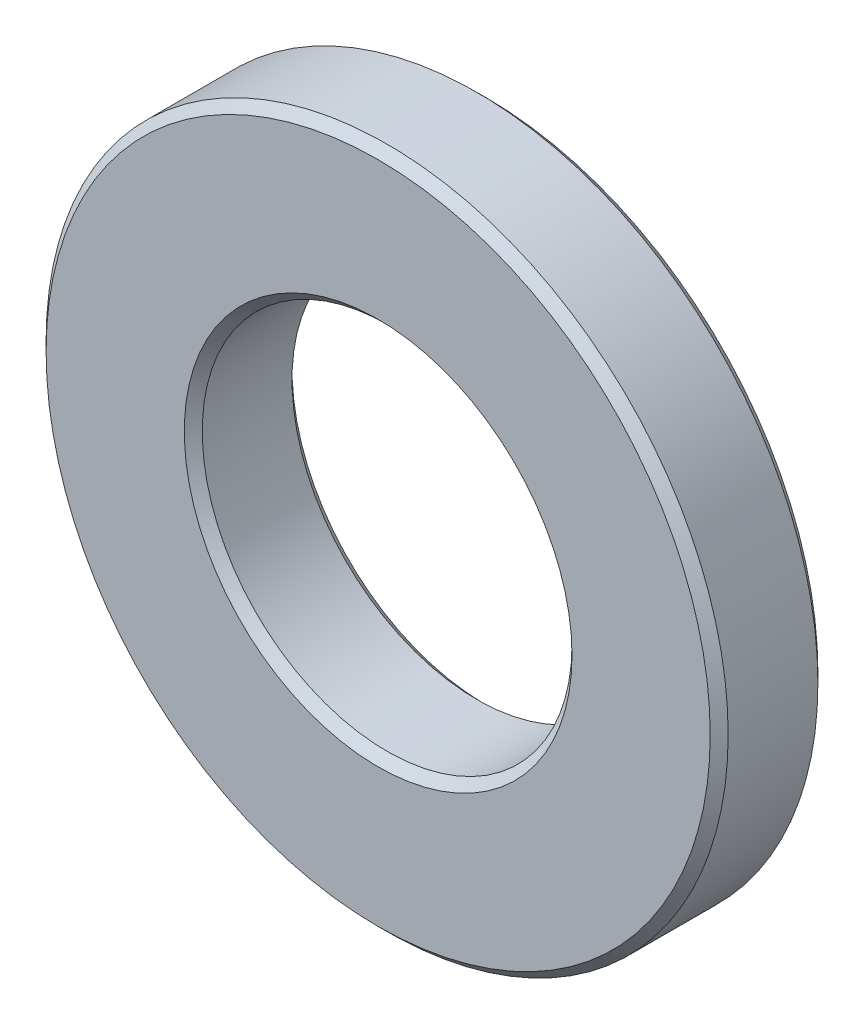
ISO-10303-21;
HEADER;
FILE_DESCRIPTION(('STEP AP214'),'2;1');
FILE_NAME('part.step','',(''),(''),'','','');
FILE_SCHEMA(('AUTOMOTIVE_DESIGN { 1 0 10303 214 1 1 1 1 }'));
ENDSEC;
DATA;
#1=APPLICATION_CONTEXT('core data for automotive mechanical design processes');
#2=APPLICATION_PROTOCOL_DEFINITION('international standard','automotive_design',2000,#1);
#3=PRODUCT_CONTEXT('',#1,'mechanical');
#4=PRODUCT('Part','Part','',(#3));
#5=PRODUCT_RELATED_PRODUCT_CATEGORY('part','',(#4));
#6=PRODUCT_DEFINITION_FORMATION('','',#4);
#7=PRODUCT_DEFINITION_CONTEXT('part definition',#1,'design');
#8=PRODUCT_DEFINITION('design','',#6,#7);
#9=PRODUCT_DEFINITION_SHAPE('','',#8);
#10=(LENGTH_UNIT() NAMED_UNIT(*) SI_UNIT(.MILLI.,.METRE.));
#11=(NAMED_UNIT(*) PLANE_ANGLE_UNIT() SI_UNIT($,.RADIAN.));
#12=(NAMED_UNIT(*) SI_UNIT($,.STERADIAN.) SOLID_ANGLE_UNIT());
#13=UNCERTAINTY_MEASURE_WITH_UNIT(LENGTH_MEASURE(1.E-05),#10,'distance_accuracy_value','');
#14=(GEOMETRIC_REPRESENTATION_CONTEXT(3) GLOBAL_UNCERTAINTY_ASSIGNED_CONTEXT((#13)) GLOBAL_UNIT_ASSIGNED_CONTEXT((#10,
#11,#12)) REPRESENTATION_CONTEXT('',''));
#15=CARTESIAN_POINT('',(0.,0.,0.));
#16=DIRECTION('',(0.,0.,1.));
#17=DIRECTION('',(1.,0.,0.));
#18=AXIS2_PLACEMENT_3D('',#15,#16,#17);
#19=CARTESIAN_POINT('',(0.,0.,6.));
#20=DIRECTION('',(0.,0.,1.));
#21=DIRECTION('',(1.,0.,0.));
#22=AXIS2_PLACEMENT_3D('',#19,#20,#21);
#23=PLANE('',#22);
#24=CARTESIAN_POINT('',(0.,0.,6.));
#25=DIRECTION('',(0.,0.,1.));
#26=DIRECTION('',(1.,0.,0.));
#27=AXIS2_PLACEMENT_3D('',#24,#25,#26);
#28=CIRCLE('',#27,18.5);
#29=CARTESIAN_POINT('',(18.5,0.,6.));
#30=VERTEX_POINT('',#29);
#31=EDGE_CURVE('E50',#30,#30,#28,.T.);
#32=ORIENTED_EDGE('',*,*,#31,.T.);
#33=EDGE_LOOP('',(#32));
#34=FACE_BOUND('',#33,.T.);
#35=CARTESIAN_POINT('',(0.,0.,6.));
#36=DIRECTION('',(0.,0.,1.));
#37=DIRECTION('',(1.,0.,0.));
#38=AXIS2_PLACEMENT_3D('',#35,#36,#37);
#39=CIRCLE('',#38,10.8);
#40=CARTESIAN_POINT('',(10.8,0.,6.));
#41=VERTEX_POINT('',#40);
#42=EDGE_CURVE('E54',#41,#41,#39,.F.);
#43=ORIENTED_EDGE('',*,*,#42,.T.);
#44=EDGE_LOOP('',(#43));
#45=FACE_BOUND('',#44,.T.);
#46=ADVANCED_FACE('F39',(#34,#45),#23,.T.);
#47=CARTESIAN_POINT('',(0.,0.,0.));
#48=DIRECTION('',(0.,0.,1.));
#49=DIRECTION('',(1.,0.,0.));
#50=AXIS2_PLACEMENT_3D('',#47,#48,#49);
#51=PLANE('',#50);
#52=CARTESIAN_POINT('',(0.,0.,0.));
#53=DIRECTION('',(0.,0.,1.));
#54=DIRECTION('',(1.,0.,0.));
#55=AXIS2_PLACEMENT_3D('',#52,#53,#54);
#56=CIRCLE('',#55,18.5);
#57=CARTESIAN_POINT('',(18.5,0.,0.));
#58=VERTEX_POINT('',#57);
#59=EDGE_CURVE('E59',#58,#58,#56,.F.);
#60=ORIENTED_EDGE('',*,*,#59,.T.);
#61=EDGE_LOOP('',(#60));
#62=FACE_BOUND('',#61,.T.);
#63=CARTESIAN_POINT('',(0.,0.,0.));
#64=DIRECTION('',(0.,0.,1.));
#65=DIRECTION('',(1.,0.,0.));
#66=AXIS2_PLACEMENT_3D('',#63,#64,#65);
#67=CIRCLE('',#66,10.8);
#68=CARTESIAN_POINT('',(10.8,0.,0.));
#69=VERTEX_POINT('',#68);
#70=EDGE_CURVE('E62',#69,#69,#67,.T.);
#71=ORIENTED_EDGE('',*,*,#70,.T.);
#72=EDGE_LOOP('',(#71));
#73=FACE_BOUND('',#72,.T.);
#74=ADVANCED_FACE('F84',(#62,#73),#51,.F.);
#75=CARTESIAN_POINT('',(0.,0.,6.));
#76=DIRECTION('',(0.,0.,-1.));
#77=DIRECTION('',(-1.,0.,0.));
#78=AXIS2_PLACEMENT_3D('',#75,#76,#77);
#79=CYLINDRICAL_SURFACE('',#78,19.);
#80=CARTESIAN_POINT('',(0.,0.,0.5));
#81=DIRECTION('',(0.,0.,1.));
#82=DIRECTION('',(1.,0.,0.));
#83=AXIS2_PLACEMENT_3D('',#80,#81,#82);
#84=CIRCLE('',#83,19.);
#85=CARTESIAN_POINT('',(19.,0.,0.5));
#86=VERTEX_POINT('',#85);
#87=EDGE_CURVE('E65',#86,#86,#84,.T.);
#88=ORIENTED_EDGE('',*,*,#87,.T.);
#89=EDGE_LOOP('',(#88));
#90=FACE_BOUND('',#89,.T.);
#91=CARTESIAN_POINT('',(0.,0.,5.49999999999999));
#92=DIRECTION('',(0.,0.,1.));
#93=DIRECTION('',(1.,0.,0.));
#94=AXIS2_PLACEMENT_3D('',#91,#92,#93);
#95=CIRCLE('',#94,19.);
#96=CARTESIAN_POINT('',(19.,0.,5.49999999999999));
#97=VERTEX_POINT('',#96);
#98=EDGE_CURVE('E68',#97,#97,#95,.F.);
#99=ORIENTED_EDGE('',*,*,#98,.T.);
#100=EDGE_LOOP('',(#99));
#101=FACE_BOUND('',#100,.T.);
#102=ADVANCED_FACE('F72',(#90,#101),#79,.T.);
#103=CARTESIAN_POINT('',(0.,0.,6.));
#104=DIRECTION('',(0.,0.,-1.));
#105=DIRECTION('',(-1.,0.,0.));
#106=AXIS2_PLACEMENT_3D('',#103,#104,#105);
#107=CYLINDRICAL_SURFACE('',#106,10.3);
#108=CARTESIAN_POINT('',(0.,0.,0.500000000000002));
#109=DIRECTION('',(0.,0.,1.));
#110=DIRECTION('',(1.,0.,0.));
#111=AXIS2_PLACEMENT_3D('',#108,#109,#110);
#112=CIRCLE('',#111,10.3);
#113=CARTESIAN_POINT('',(10.3,0.,0.500000000000002));
#114=VERTEX_POINT('',#113);
#115=EDGE_CURVE('E10',#114,#114,#112,.F.);
#116=ORIENTED_EDGE('',*,*,#115,.T.);
#117=EDGE_LOOP('',(#116));
#118=FACE_BOUND('',#117,.T.);
#119=CARTESIAN_POINT('',(0.,0.,5.5));
#120=DIRECTION('',(0.,0.,1.));
#121=DIRECTION('',(1.,0.,0.));
#122=AXIS2_PLACEMENT_3D('',#119,#120,#121);
#123=CIRCLE('',#122,10.3);
#124=CARTESIAN_POINT('',(10.3,0.,5.5));
#125=VERTEX_POINT('',#124);
#126=EDGE_CURVE('E46',#125,#125,#123,.T.);
#127=ORIENTED_EDGE('',*,*,#126,.T.);
#128=EDGE_LOOP('',(#127));
#129=FACE_BOUND('',#128,.T.);
#130=ADVANCED_FACE('F100',(#118,#129),#107,.F.);
#131=CARTESIAN_POINT('',(0.,0.,0.5));
#132=DIRECTION('',(0.,0.,1.));
#133=DIRECTION('',(1.,0.,0.));
#134=AXIS2_PLACEMENT_3D('',#131,#132,#133);
#135=CONICAL_SURFACE('',#134,19.,0.785398163397452);
#136=ORIENTED_EDGE('',*,*,#59,.F.);
#137=EDGE_LOOP('',(#136));
#138=FACE_BOUND('',#137,.T.);
#139=ORIENTED_EDGE('',*,*,#87,.F.);
#140=EDGE_LOOP('',(#139));
#141=FACE_BOUND('',#140,.T.);
#142=ADVANCED_FACE('F78',(#138,#141),#135,.T.);
#143=CARTESIAN_POINT('',(0.,0.,6.));
#144=DIRECTION('',(0.,0.,-1.));
#145=DIRECTION('',(-1.,0.,0.));
#146=AXIS2_PLACEMENT_3D('',#143,#144,#145);
#147=CONICAL_SURFACE('',#146,18.5,0.785398163397436);
#148=ORIENTED_EDGE('',*,*,#98,.F.);
#149=EDGE_LOOP('',(#148));
#150=FACE_BOUND('',#149,.T.);
#151=ORIENTED_EDGE('',*,*,#31,.F.);
#152=EDGE_LOOP('',(#151));
#153=FACE_BOUND('',#152,.T.);
#154=ADVANCED_FACE('F74',(#150,#153),#147,.T.);
#155=CARTESIAN_POINT('',(0.,0.,0.));
#156=DIRECTION('',(0.,0.,-1.));
#157=DIRECTION('',(-1.,0.,0.));
#158=AXIS2_PLACEMENT_3D('',#155,#156,#157);
#159=CONICAL_SURFACE('',#158,10.8,0.785398163397447);
#160=ORIENTED_EDGE('',*,*,#115,.F.);
#161=EDGE_LOOP('',(#160));
#162=FACE_BOUND('',#161,.T.);
#163=ORIENTED_EDGE('',*,*,#70,.F.);
#164=EDGE_LOOP('',(#163));
#165=FACE_BOUND('',#164,.T.);
#166=ADVANCED_FACE('F77',(#162,#165),#159,.F.);
#167=CARTESIAN_POINT('',(0.,0.,5.5));
#168=DIRECTION('',(0.,0.,1.));
#169=DIRECTION('',(1.,0.,0.));
#170=AXIS2_PLACEMENT_3D('',#167,#168,#169);
#171=CONICAL_SURFACE('',#170,10.3,0.78539816339745);
#172=ORIENTED_EDGE('',*,*,#42,.F.);
#173=EDGE_LOOP('',(#172));
#174=FACE_BOUND('',#173,.T.);
#175=ORIENTED_EDGE('',*,*,#126,.F.);
#176=EDGE_LOOP('',(#175));
#177=FACE_BOUND('',#176,.T.);
#178=ADVANCED_FACE('F41',(#174,#177),#171,.F.);
#179=CLOSED_SHELL('',(#46,#74,#102,#130,#142,#154,#166,#178));
#180=MANIFOLD_SOLID_BREP('B2',#179);
#181=ADVANCED_BREP_SHAPE_REPRESENTATION('',(#18,#180),#14);
#182=SHAPE_DEFINITION_REPRESENTATION(#9,#181);
ENDSEC;
END-ISO-10303-21;
